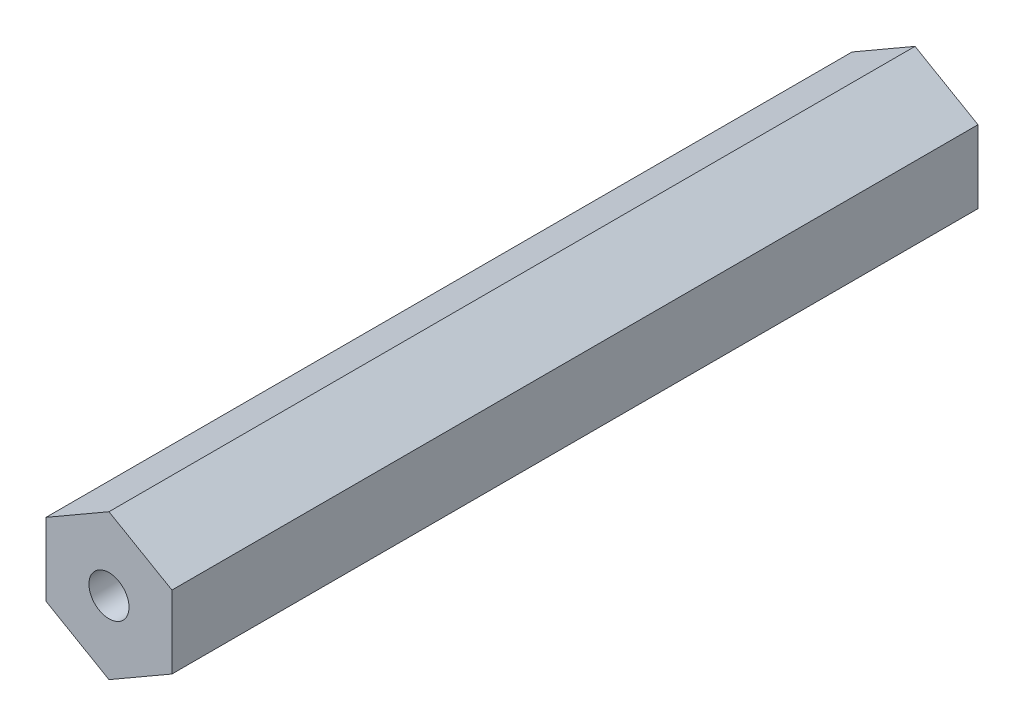
ISO-10303-21;
HEADER;
FILE_DESCRIPTION(('STEP AP214'),'2;1');
FILE_NAME('part.step','',(''),(''),'','','');
FILE_SCHEMA(('AUTOMOTIVE_DESIGN { 1 0 10303 214 1 1 1 1 }'));
ENDSEC;
DATA;
#1=APPLICATION_CONTEXT('core data for automotive mechanical design processes');
#2=APPLICATION_PROTOCOL_DEFINITION('international standard','automotive_design',2000,#1);
#3=PRODUCT_CONTEXT('',#1,'mechanical');
#4=PRODUCT('Part','Part','',(#3));
#5=PRODUCT_RELATED_PRODUCT_CATEGORY('part','',(#4));
#6=PRODUCT_DEFINITION_FORMATION('','',#4);
#7=PRODUCT_DEFINITION_CONTEXT('part definition',#1,'design');
#8=PRODUCT_DEFINITION('design','',#6,#7);
#9=PRODUCT_DEFINITION_SHAPE('','',#8);
#10=(LENGTH_UNIT() NAMED_UNIT(*) SI_UNIT(.MILLI.,.METRE.));
#11=(NAMED_UNIT(*) PLANE_ANGLE_UNIT() SI_UNIT($,.RADIAN.));
#12=(NAMED_UNIT(*) SI_UNIT($,.STERADIAN.) SOLID_ANGLE_UNIT());
#13=UNCERTAINTY_MEASURE_WITH_UNIT(LENGTH_MEASURE(1.E-05),#10,'distance_accuracy_value','');
#14=(GEOMETRIC_REPRESENTATION_CONTEXT(3) GLOBAL_UNCERTAINTY_ASSIGNED_CONTEXT((#13)) GLOBAL_UNIT_ASSIGNED_CONTEXT((#10,
#11,#12)) REPRESENTATION_CONTEXT('',''));
#15=CARTESIAN_POINT('',(0.,0.,0.));
#16=DIRECTION('',(0.,0.,1.));
#17=DIRECTION('',(1.,0.,0.));
#18=AXIS2_PLACEMENT_3D('',#15,#16,#17);
#19=CARTESIAN_POINT('',(6.35,3.66617420935412,40.64));
#20=DIRECTION('',(-0.5,-0.866025403784439,0.));
#21=DIRECTION('',(0.866025403784439,-0.5,0.));
#22=AXIS2_PLACEMENT_3D('',#19,#20,#21);
#23=PLANE('',#22);
#24=DIRECTION('',(-0.866025403784439,0.5,0.));
#25=VECTOR('',#24,1.);
#26=CARTESIAN_POINT('',(6.35,3.66617420935412,-40.64));
#27=LINE('',#26,#25);
#28=CARTESIAN_POINT('',(6.35,3.66617420935412,-40.64));
#29=VERTEX_POINT('',#28);
#30=CARTESIAN_POINT('',(0.,7.33234841870825,-40.64));
#31=VERTEX_POINT('',#30);
#32=EDGE_CURVE('E134',#29,#31,#27,.T.);
#33=ORIENTED_EDGE('',*,*,#32,.T.);
#34=DIRECTION('',(0.,0.,-1.));
#35=VECTOR('',#34,1.);
#36=CARTESIAN_POINT('',(0.,7.33234841870825,40.64));
#37=LINE('',#36,#35);
#38=CARTESIAN_POINT('',(0.,7.33234841870825,40.64));
#39=VERTEX_POINT('',#38);
#40=EDGE_CURVE('E11',#39,#31,#37,.T.);
#41=ORIENTED_EDGE('',*,*,#40,.F.);
#42=DIRECTION('',(-0.866025403784439,0.5,0.));
#43=VECTOR('',#42,1.);
#44=CARTESIAN_POINT('',(6.35,3.66617420935412,40.64));
#45=LINE('',#44,#43);
#46=CARTESIAN_POINT('',(6.35,3.66617420935412,40.64));
#47=VERTEX_POINT('',#46);
#48=EDGE_CURVE('E151',#47,#39,#45,.T.);
#49=ORIENTED_EDGE('',*,*,#48,.F.);
#50=DIRECTION('',(0.,0.,-1.));
#51=VECTOR('',#50,1.);
#52=CARTESIAN_POINT('',(6.35,3.66617420935412,40.64));
#53=LINE('',#52,#51);
#54=EDGE_CURVE('E130',#47,#29,#53,.T.);
#55=ORIENTED_EDGE('',*,*,#54,.T.);
#56=EDGE_LOOP('',(#33,#41,#49,#55));
#57=FACE_BOUND('',#56,.T.);
#58=ADVANCED_FACE('F45',(#57),#23,.F.);
#59=CARTESIAN_POINT('',(0.,7.33234841870825,40.64));
#60=DIRECTION('',(0.5,-0.866025403784439,0.));
#61=DIRECTION('',(0.866025403784439,0.5,0.));
#62=AXIS2_PLACEMENT_3D('',#59,#60,#61);
#63=PLANE('',#62);
#64=DIRECTION('',(-0.866025403784439,-0.5,0.));
#65=VECTOR('',#64,1.);
#66=CARTESIAN_POINT('',(0.,7.33234841870825,-40.64));
#67=LINE('',#66,#65);
#68=CARTESIAN_POINT('',(-6.35,3.66617420935412,-40.64));
#69=VERTEX_POINT('',#68);
#70=EDGE_CURVE('E138',#31,#69,#67,.T.);
#71=ORIENTED_EDGE('',*,*,#70,.T.);
#72=DIRECTION('',(0.,0.,-1.));
#73=VECTOR('',#72,1.);
#74=CARTESIAN_POINT('',(-6.35,3.66617420935412,40.64));
#75=LINE('',#74,#73);
#76=CARTESIAN_POINT('',(-6.35,3.66617420935412,40.64));
#77=VERTEX_POINT('',#76);
#78=EDGE_CURVE('E54',#77,#69,#75,.T.);
#79=ORIENTED_EDGE('',*,*,#78,.F.);
#80=DIRECTION('',(-0.866025403784439,-0.5,0.));
#81=VECTOR('',#80,1.);
#82=CARTESIAN_POINT('',(0.,7.33234841870825,40.64));
#83=LINE('',#82,#81);
#84=EDGE_CURVE('E99',#39,#77,#83,.T.);
#85=ORIENTED_EDGE('',*,*,#84,.F.);
#86=ORIENTED_EDGE('',*,*,#40,.T.);
#87=EDGE_LOOP('',(#71,#79,#85,#86));
#88=FACE_BOUND('',#87,.T.);
#89=ADVANCED_FACE('F180',(#88),#63,.F.);
#90=CARTESIAN_POINT('',(-6.35,3.66617420935412,40.64));
#91=DIRECTION('',(1.,0.,0.));
#92=DIRECTION('',(0.,0.,-1.));
#93=AXIS2_PLACEMENT_3D('',#90,#91,#92);
#94=PLANE('',#93);
#95=DIRECTION('',(0.,-1.,0.));
#96=VECTOR('',#95,1.);
#97=CARTESIAN_POINT('',(-6.35,3.66617420935412,-40.64));
#98=LINE('',#97,#96);
#99=CARTESIAN_POINT('',(-6.35,-3.66617420935412,-40.64));
#100=VERTEX_POINT('',#99);
#101=EDGE_CURVE('E142',#69,#100,#98,.T.);
#102=ORIENTED_EDGE('',*,*,#101,.T.);
#103=DIRECTION('',(0.,0.,-1.));
#104=VECTOR('',#103,1.);
#105=CARTESIAN_POINT('',(-6.35,-3.66617420935412,40.64));
#106=LINE('',#105,#104);
#107=CARTESIAN_POINT('',(-6.35,-3.66617420935412,40.64));
#108=VERTEX_POINT('',#107);
#109=EDGE_CURVE('E123',#108,#100,#106,.T.);
#110=ORIENTED_EDGE('',*,*,#109,.F.);
#111=DIRECTION('',(0.,-1.,0.));
#112=VECTOR('',#111,1.);
#113=CARTESIAN_POINT('',(-6.35,3.66617420935412,40.64));
#114=LINE('',#113,#112);
#115=EDGE_CURVE('E112',#77,#108,#114,.T.);
#116=ORIENTED_EDGE('',*,*,#115,.F.);
#117=ORIENTED_EDGE('',*,*,#78,.T.);
#118=EDGE_LOOP('',(#102,#110,#116,#117));
#119=FACE_BOUND('',#118,.T.);
#120=ADVANCED_FACE('F161',(#119),#94,.F.);
#121=CARTESIAN_POINT('',(-6.35,-3.66617420935412,40.64));
#122=DIRECTION('',(0.5,0.866025403784439,0.));
#123=DIRECTION('',(-0.866025403784438,0.5,0.));
#124=AXIS2_PLACEMENT_3D('',#121,#122,#123);
#125=PLANE('',#124);
#126=DIRECTION('',(0.866025403784438,-0.5,0.));
#127=VECTOR('',#126,1.);
#128=CARTESIAN_POINT('',(-6.35,-3.66617420935412,-40.64));
#129=LINE('',#128,#127);
#130=CARTESIAN_POINT('',(0.,-7.33234841870825,-40.64));
#131=VERTEX_POINT('',#130);
#132=EDGE_CURVE('E121',#100,#131,#129,.T.);
#133=ORIENTED_EDGE('',*,*,#132,.T.);
#134=DIRECTION('',(0.,0.,-1.));
#135=VECTOR('',#134,1.);
#136=CARTESIAN_POINT('',(0.,-7.33234841870825,40.64));
#137=LINE('',#136,#135);
#138=CARTESIAN_POINT('',(0.,-7.33234841870825,40.64));
#139=VERTEX_POINT('',#138);
#140=EDGE_CURVE('E118',#139,#131,#137,.T.);
#141=ORIENTED_EDGE('',*,*,#140,.F.);
#142=DIRECTION('',(0.866025403784438,-0.5,0.));
#143=VECTOR('',#142,1.);
#144=CARTESIAN_POINT('',(-6.35,-3.66617420935412,40.64));
#145=LINE('',#144,#143);
#146=EDGE_CURVE('E106',#108,#139,#145,.T.);
#147=ORIENTED_EDGE('',*,*,#146,.F.);
#148=ORIENTED_EDGE('',*,*,#109,.T.);
#149=EDGE_LOOP('',(#133,#141,#147,#148));
#150=FACE_BOUND('',#149,.T.);
#151=ADVANCED_FACE('F119',(#150),#125,.F.);
#152=CARTESIAN_POINT('',(0.,-7.33234841870825,40.64));
#153=DIRECTION('',(-0.5,0.866025403784439,0.));
#154=DIRECTION('',(-0.866025403784439,-0.5,0.));
#155=AXIS2_PLACEMENT_3D('',#152,#153,#154);
#156=PLANE('',#155);
#157=DIRECTION('',(0.866025403784439,0.5,0.));
#158=VECTOR('',#157,1.);
#159=CARTESIAN_POINT('',(0.,-7.33234841870825,-40.64));
#160=LINE('',#159,#158);
#161=CARTESIAN_POINT('',(6.35,-3.66617420935412,-40.64));
#162=VERTEX_POINT('',#161);
#163=EDGE_CURVE('E85',#131,#162,#160,.T.);
#164=ORIENTED_EDGE('',*,*,#163,.T.);
#165=DIRECTION('',(0.,0.,-1.));
#166=VECTOR('',#165,1.);
#167=CARTESIAN_POINT('',(6.35,-3.66617420935412,40.64));
#168=LINE('',#167,#166);
#169=CARTESIAN_POINT('',(6.35,-3.66617420935412,40.64));
#170=VERTEX_POINT('',#169);
#171=EDGE_CURVE('E124',#170,#162,#168,.T.);
#172=ORIENTED_EDGE('',*,*,#171,.F.);
#173=DIRECTION('',(0.866025403784439,0.5,0.));
#174=VECTOR('',#173,1.);
#175=CARTESIAN_POINT('',(0.,-7.33234841870825,40.64));
#176=LINE('',#175,#174);
#177=EDGE_CURVE('E110',#139,#170,#176,.T.);
#178=ORIENTED_EDGE('',*,*,#177,.F.);
#179=ORIENTED_EDGE('',*,*,#140,.T.);
#180=EDGE_LOOP('',(#164,#172,#178,#179));
#181=FACE_BOUND('',#180,.T.);
#182=ADVANCED_FACE('F126',(#181),#156,.F.);
#183=CARTESIAN_POINT('',(6.35,-3.66617420935412,40.64));
#184=DIRECTION('',(-1.,0.,0.));
#185=DIRECTION('',(0.,-1.,0.));
#186=AXIS2_PLACEMENT_3D('',#183,#184,#185);
#187=PLANE('',#186);
#188=DIRECTION('',(0.,1.,0.));
#189=VECTOR('',#188,1.);
#190=CARTESIAN_POINT('',(6.35,-3.66617420935412,-40.64));
#191=LINE('',#190,#189);
#192=EDGE_CURVE('E91',#162,#29,#191,.T.);
#193=ORIENTED_EDGE('',*,*,#192,.T.);
#194=ORIENTED_EDGE('',*,*,#54,.F.);
#195=DIRECTION('',(0.,1.,0.));
#196=VECTOR('',#195,1.);
#197=CARTESIAN_POINT('',(6.35,-3.66617420935412,40.64));
#198=LINE('',#197,#196);
#199=EDGE_CURVE('E62',#170,#47,#198,.T.);
#200=ORIENTED_EDGE('',*,*,#199,.F.);
#201=ORIENTED_EDGE('',*,*,#171,.T.);
#202=EDGE_LOOP('',(#193,#194,#200,#201));
#203=FACE_BOUND('',#202,.T.);
#204=ADVANCED_FACE('F168',(#203),#187,.F.);
#205=CARTESIAN_POINT('',(0.,0.,40.64));
#206=DIRECTION('',(0.,0.,1.));
#207=DIRECTION('',(1.,0.,0.));
#208=AXIS2_PLACEMENT_3D('',#205,#206,#207);
#209=PLANE('',#208);
#210=CARTESIAN_POINT('',(0.,0.,40.64));
#211=DIRECTION('',(0.,0.,-1.));
#212=DIRECTION('',(-1.,0.,0.));
#213=AXIS2_PLACEMENT_3D('',#210,#211,#212);
#214=CIRCLE('',#213,2.0193);
#215=CARTESIAN_POINT('',(-2.0193,0.,40.64));
#216=VERTEX_POINT('',#215);
#217=EDGE_CURVE('E139',#216,#216,#214,.T.);
#218=ORIENTED_EDGE('',*,*,#217,.T.);
#219=EDGE_LOOP('',(#218));
#220=FACE_BOUND('',#219,.T.);
#221=ORIENTED_EDGE('',*,*,#48,.T.);
#222=ORIENTED_EDGE('',*,*,#84,.T.);
#223=ORIENTED_EDGE('',*,*,#115,.T.);
#224=ORIENTED_EDGE('',*,*,#146,.T.);
#225=ORIENTED_EDGE('',*,*,#177,.T.);
#226=ORIENTED_EDGE('',*,*,#199,.T.);
#227=EDGE_LOOP('',(#221,#222,#223,#224,#225,#226));
#228=FACE_BOUND('',#227,.T.);
#229=ADVANCED_FACE('F108',(#220,#228),#209,.T.);
#230=CARTESIAN_POINT('',(0.,0.,-40.64));
#231=DIRECTION('',(0.,0.,1.));
#232=DIRECTION('',(1.,0.,0.));
#233=AXIS2_PLACEMENT_3D('',#230,#231,#232);
#234=PLANE('',#233);
#235=CARTESIAN_POINT('',(0.,0.,-40.64));
#236=DIRECTION('',(0.,0.,-1.));
#237=DIRECTION('',(-1.,0.,0.));
#238=AXIS2_PLACEMENT_3D('',#235,#236,#237);
#239=CIRCLE('',#238,2.0193);
#240=CARTESIAN_POINT('',(-2.0193,0.,-40.64));
#241=VERTEX_POINT('',#240);
#242=EDGE_CURVE('E236',#241,#241,#239,.T.);
#243=ORIENTED_EDGE('',*,*,#242,.F.);
#244=EDGE_LOOP('',(#243));
#245=FACE_BOUND('',#244,.T.);
#246=ORIENTED_EDGE('',*,*,#32,.F.);
#247=ORIENTED_EDGE('',*,*,#192,.F.);
#248=ORIENTED_EDGE('',*,*,#163,.F.);
#249=ORIENTED_EDGE('',*,*,#132,.F.);
#250=ORIENTED_EDGE('',*,*,#101,.F.);
#251=ORIENTED_EDGE('',*,*,#70,.F.);
#252=EDGE_LOOP('',(#246,#247,#248,#249,#250,#251));
#253=FACE_BOUND('',#252,.T.);
#254=ADVANCED_FACE('F164',(#245,#253),#234,.F.);
#255=CARTESIAN_POINT('',(0.,0.,40.64));
#256=DIRECTION('',(0.,0.,-1.));
#257=DIRECTION('',(-1.,0.,0.));
#258=AXIS2_PLACEMENT_3D('',#255,#256,#257);
#259=CYLINDRICAL_SURFACE('',#258,2.0193);
#260=ORIENTED_EDGE('',*,*,#217,.F.);
#261=EDGE_LOOP('',(#260));
#262=FACE_BOUND('',#261,.T.);
#263=ORIENTED_EDGE('',*,*,#242,.T.);
#264=EDGE_LOOP('',(#263));
#265=FACE_BOUND('',#264,.T.);
#266=ADVANCED_FACE('F219',(#262,#265),#259,.F.);
#267=CLOSED_SHELL('',(#58,#89,#120,#151,#182,#204,#229,#254,#266));
#268=MANIFOLD_SOLID_BREP('B2',#267);
#269=ADVANCED_BREP_SHAPE_REPRESENTATION('',(#18,#268),#14);
#270=SHAPE_DEFINITION_REPRESENTATION(#9,#269);
ENDSEC;
END-ISO-10303-21;
